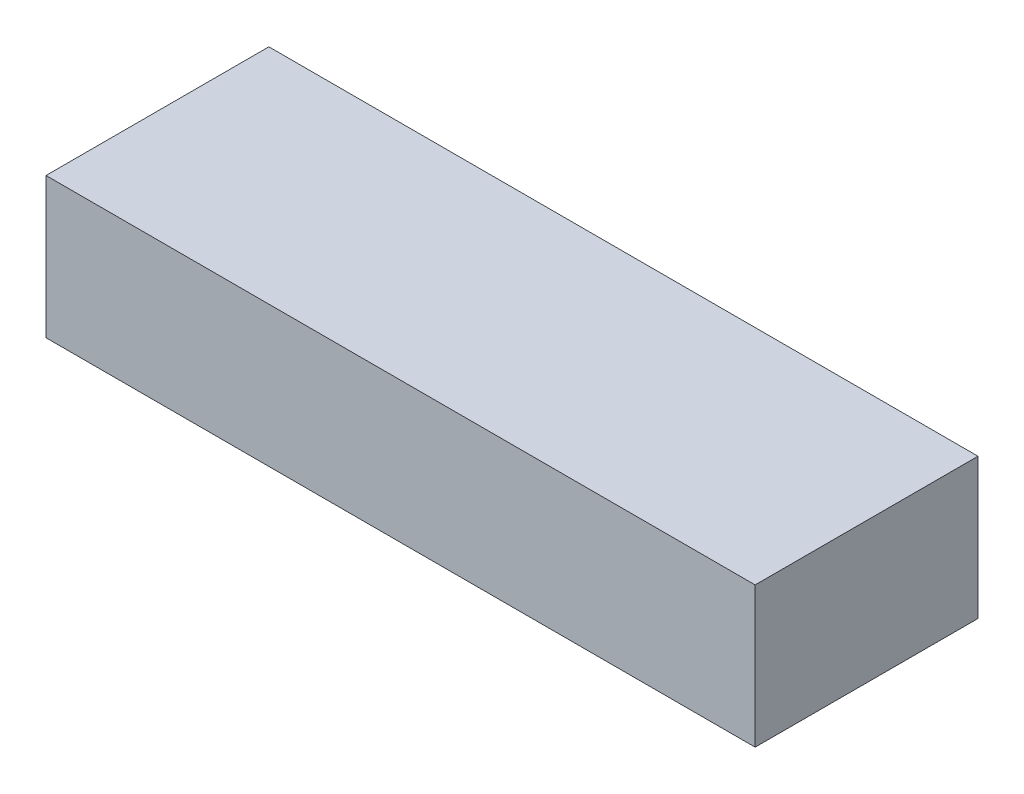
ISO-10303-21;
HEADER;
FILE_DESCRIPTION(('STEP AP214'),'2;1');
FILE_NAME('part.step','',(''),(''),'','','');
FILE_SCHEMA(('AUTOMOTIVE_DESIGN { 1 0 10303 214 1 1 1 1 }'));
ENDSEC;
DATA;
#1=APPLICATION_CONTEXT('core data for automotive mechanical design processes');
#2=APPLICATION_PROTOCOL_DEFINITION('international standard','automotive_design',2000,#1);
#3=PRODUCT_CONTEXT('',#1,'mechanical');
#4=PRODUCT('Part','Part','',(#3));
#5=PRODUCT_RELATED_PRODUCT_CATEGORY('part','',(#4));
#6=PRODUCT_DEFINITION_FORMATION('','',#4);
#7=PRODUCT_DEFINITION_CONTEXT('part definition',#1,'design');
#8=PRODUCT_DEFINITION('design','',#6,#7);
#9=PRODUCT_DEFINITION_SHAPE('','',#8);
#10=(LENGTH_UNIT() NAMED_UNIT(*) SI_UNIT(.MILLI.,.METRE.));
#11=(NAMED_UNIT(*) PLANE_ANGLE_UNIT() SI_UNIT($,.RADIAN.));
#12=(NAMED_UNIT(*) SI_UNIT($,.STERADIAN.) SOLID_ANGLE_UNIT());
#13=UNCERTAINTY_MEASURE_WITH_UNIT(LENGTH_MEASURE(1.E-05),#10,'distance_accuracy_value','');
#14=(GEOMETRIC_REPRESENTATION_CONTEXT(3) GLOBAL_UNCERTAINTY_ASSIGNED_CONTEXT((#13)) GLOBAL_UNIT_ASSIGNED_CONTEXT((#10,
#11,#12)) REPRESENTATION_CONTEXT('',''));
#15=CARTESIAN_POINT('',(0.,0.,0.));
#16=DIRECTION('',(0.,0.,1.));
#17=DIRECTION('',(1.,0.,0.));
#18=AXIS2_PLACEMENT_3D('',#15,#16,#17);
#19=CARTESIAN_POINT('',(70.,27.75,22.));
#20=DIRECTION('',(-1.,0.,0.));
#21=DIRECTION('',(0.,0.,1.));
#22=AXIS2_PLACEMENT_3D('',#19,#20,#21);
#23=PLANE('',#22);
#24=DIRECTION('',(0.,0.,-1.));
#25=VECTOR('',#24,1.);
#26=CARTESIAN_POINT('',(70.,0.,22.));
#27=LINE('',#26,#25);
#28=CARTESIAN_POINT('',(70.,0.,22.));
#29=VERTEX_POINT('',#28);
#30=CARTESIAN_POINT('',(70.,0.,-22.));
#31=VERTEX_POINT('',#30);
#32=EDGE_CURVE('E111',#29,#31,#27,.T.);
#33=ORIENTED_EDGE('',*,*,#32,.T.);
#34=DIRECTION('',(0.,-1.,0.));
#35=VECTOR('',#34,1.);
#36=CARTESIAN_POINT('',(70.,27.75,-22.));
#37=LINE('',#36,#35);
#38=CARTESIAN_POINT('',(70.,27.75,-22.));
#39=VERTEX_POINT('',#38);
#40=EDGE_CURVE('E11',#39,#31,#37,.T.);
#41=ORIENTED_EDGE('',*,*,#40,.F.);
#42=DIRECTION('',(0.,0.,-1.));
#43=VECTOR('',#42,1.);
#44=CARTESIAN_POINT('',(70.,27.75,22.));
#45=LINE('',#44,#43);
#46=CARTESIAN_POINT('',(70.,27.75,22.));
#47=VERTEX_POINT('',#46);
#48=EDGE_CURVE('E95',#47,#39,#45,.T.);
#49=ORIENTED_EDGE('',*,*,#48,.F.);
#50=DIRECTION('',(0.,-1.,0.));
#51=VECTOR('',#50,1.);
#52=CARTESIAN_POINT('',(70.,27.75,22.));
#53=LINE('',#52,#51);
#54=EDGE_CURVE('E107',#47,#29,#53,.T.);
#55=ORIENTED_EDGE('',*,*,#54,.T.);
#56=EDGE_LOOP('',(#33,#41,#49,#55));
#57=FACE_BOUND('',#56,.T.);
#58=ADVANCED_FACE('F43',(#57),#23,.F.);
#59=CARTESIAN_POINT('',(-70.,27.75,-22.));
#60=DIRECTION('',(0.,0.,1.));
#61=DIRECTION('',(1.,0.,0.));
#62=AXIS2_PLACEMENT_3D('',#59,#60,#61);
#63=PLANE('',#62);
#64=DIRECTION('',(-1.,0.,0.));
#65=VECTOR('',#64,1.);
#66=CARTESIAN_POINT('',(-70.,0.,-22.));
#67=LINE('',#66,#65);
#68=CARTESIAN_POINT('',(-70.,0.,-22.));
#69=VERTEX_POINT('',#68);
#70=EDGE_CURVE('E100',#31,#69,#67,.T.);
#71=ORIENTED_EDGE('',*,*,#70,.T.);
#72=DIRECTION('',(0.,-1.,0.));
#73=VECTOR('',#72,1.);
#74=CARTESIAN_POINT('',(-70.,27.75,-22.));
#75=LINE('',#74,#73);
#76=CARTESIAN_POINT('',(-70.,27.75,-22.));
#77=VERTEX_POINT('',#76);
#78=EDGE_CURVE('E52',#77,#69,#75,.T.);
#79=ORIENTED_EDGE('',*,*,#78,.F.);
#80=DIRECTION('',(-1.,0.,0.));
#81=VECTOR('',#80,1.);
#82=CARTESIAN_POINT('',(-70.,27.75,-22.));
#83=LINE('',#82,#81);
#84=EDGE_CURVE('E90',#39,#77,#83,.T.);
#85=ORIENTED_EDGE('',*,*,#84,.F.);
#86=ORIENTED_EDGE('',*,*,#40,.T.);
#87=EDGE_LOOP('',(#71,#79,#85,#86));
#88=FACE_BOUND('',#87,.T.);
#89=ADVANCED_FACE('F99',(#88),#63,.F.);
#90=CARTESIAN_POINT('',(-70.,27.75,22.));
#91=DIRECTION('',(1.,0.,0.));
#92=DIRECTION('',(0.,0.,-1.));
#93=AXIS2_PLACEMENT_3D('',#90,#91,#92);
#94=PLANE('',#93);
#95=DIRECTION('',(0.,0.,1.));
#96=VECTOR('',#95,1.);
#97=CARTESIAN_POINT('',(-70.,0.,22.));
#98=LINE('',#97,#96);
#99=CARTESIAN_POINT('',(-70.,0.,22.));
#100=VERTEX_POINT('',#99);
#101=EDGE_CURVE('E77',#69,#100,#98,.T.);
#102=ORIENTED_EDGE('',*,*,#101,.T.);
#103=DIRECTION('',(0.,-1.,0.));
#104=VECTOR('',#103,1.);
#105=CARTESIAN_POINT('',(-70.,27.75,22.));
#106=LINE('',#105,#104);
#107=CARTESIAN_POINT('',(-70.,27.75,22.));
#108=VERTEX_POINT('',#107);
#109=EDGE_CURVE('E102',#108,#100,#106,.T.);
#110=ORIENTED_EDGE('',*,*,#109,.F.);
#111=DIRECTION('',(0.,0.,1.));
#112=VECTOR('',#111,1.);
#113=CARTESIAN_POINT('',(-70.,27.75,22.));
#114=LINE('',#113,#112);
#115=EDGE_CURVE('E93',#77,#108,#114,.T.);
#116=ORIENTED_EDGE('',*,*,#115,.F.);
#117=ORIENTED_EDGE('',*,*,#78,.T.);
#118=EDGE_LOOP('',(#102,#110,#116,#117));
#119=FACE_BOUND('',#118,.T.);
#120=ADVANCED_FACE('F103',(#119),#94,.F.);
#121=CARTESIAN_POINT('',(-70.,27.75,22.));
#122=DIRECTION('',(0.,0.,-1.));
#123=DIRECTION('',(-1.,0.,0.));
#124=AXIS2_PLACEMENT_3D('',#121,#122,#123);
#125=PLANE('',#124);
#126=DIRECTION('',(1.,0.,0.));
#127=VECTOR('',#126,1.);
#128=CARTESIAN_POINT('',(-70.,0.,22.));
#129=LINE('',#128,#127);
#130=EDGE_CURVE('E83',#100,#29,#129,.T.);
#131=ORIENTED_EDGE('',*,*,#130,.T.);
#132=ORIENTED_EDGE('',*,*,#54,.F.);
#133=DIRECTION('',(1.,0.,0.));
#134=VECTOR('',#133,1.);
#135=CARTESIAN_POINT('',(-70.,27.75,22.));
#136=LINE('',#135,#134);
#137=EDGE_CURVE('E60',#108,#47,#136,.T.);
#138=ORIENTED_EDGE('',*,*,#137,.F.);
#139=ORIENTED_EDGE('',*,*,#109,.T.);
#140=EDGE_LOOP('',(#131,#132,#138,#139));
#141=FACE_BOUND('',#140,.T.);
#142=ADVANCED_FACE('F124',(#141),#125,.F.);
#143=CARTESIAN_POINT('',(0.,27.75,0.));
#144=DIRECTION('',(0.,-1.,0.));
#145=DIRECTION('',(0.,0.,-1.));
#146=AXIS2_PLACEMENT_3D('',#143,#144,#145);
#147=PLANE('',#146);
#148=ORIENTED_EDGE('',*,*,#48,.T.);
#149=ORIENTED_EDGE('',*,*,#84,.T.);
#150=ORIENTED_EDGE('',*,*,#115,.T.);
#151=ORIENTED_EDGE('',*,*,#137,.T.);
#152=EDGE_LOOP('',(#148,#149,#150,#151));
#153=FACE_BOUND('',#152,.T.);
#154=ADVANCED_FACE('F91',(#153),#147,.F.);
#155=CARTESIAN_POINT('',(0.,0.,0.));
#156=DIRECTION('',(0.,-1.,0.));
#157=DIRECTION('',(0.,0.,-1.));
#158=AXIS2_PLACEMENT_3D('',#155,#156,#157);
#159=PLANE('',#158);
#160=ORIENTED_EDGE('',*,*,#32,.F.);
#161=ORIENTED_EDGE('',*,*,#130,.F.);
#162=ORIENTED_EDGE('',*,*,#101,.F.);
#163=ORIENTED_EDGE('',*,*,#70,.F.);
#164=EDGE_LOOP('',(#160,#161,#162,#163));
#165=FACE_BOUND('',#164,.T.);
#166=ADVANCED_FACE('F127',(#165),#159,.T.);
#167=CLOSED_SHELL('',(#58,#89,#120,#142,#154,#166));
#168=MANIFOLD_SOLID_BREP('B2',#167);
#169=ADVANCED_BREP_SHAPE_REPRESENTATION('',(#18,#168),#14);
#170=SHAPE_DEFINITION_REPRESENTATION(#9,#169);
ENDSEC;
END-ISO-10303-21;
